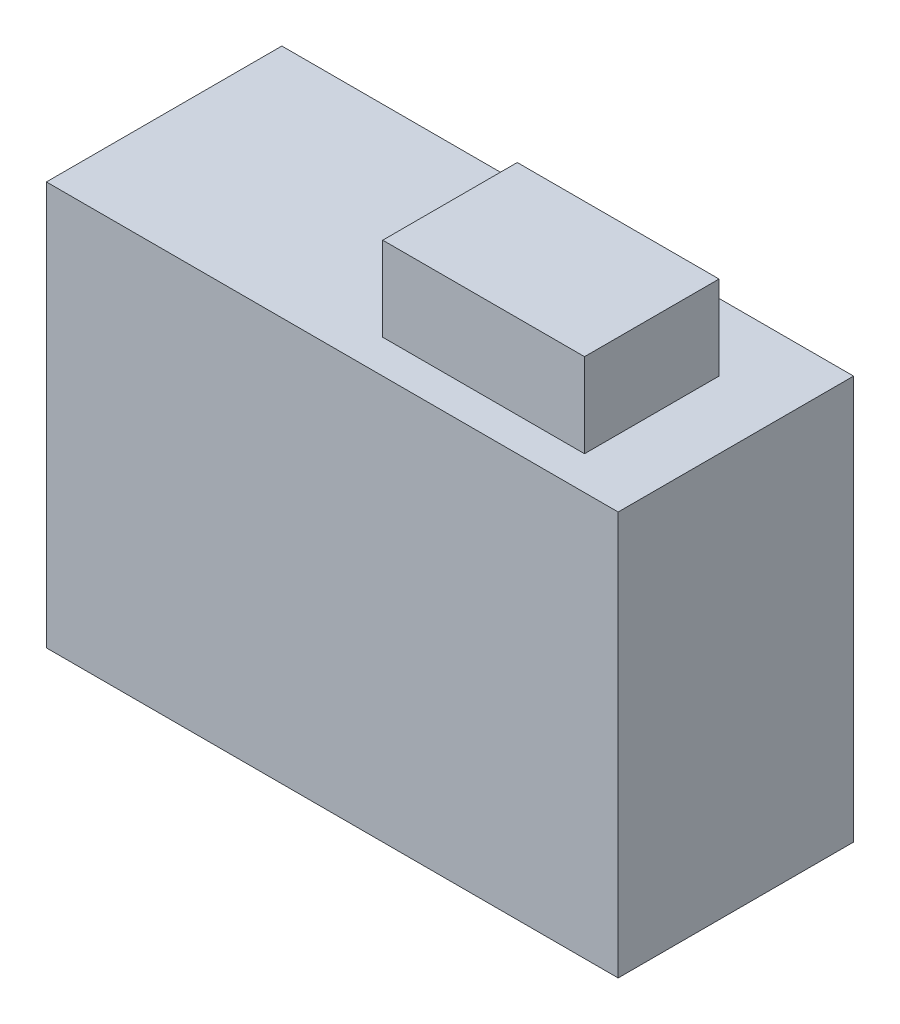
ISO-10303-21;
HEADER;
FILE_DESCRIPTION(('STEP AP214'),'2;1');
FILE_NAME('part.step','',(''),(''),'','','');
FILE_SCHEMA(('AUTOMOTIVE_DESIGN { 1 0 10303 214 1 1 1 1 }'));
ENDSEC;
DATA;
#1=APPLICATION_CONTEXT('core data for automotive mechanical design processes');
#2=APPLICATION_PROTOCOL_DEFINITION('international standard','automotive_design',2000,#1);
#3=PRODUCT_CONTEXT('',#1,'mechanical');
#4=PRODUCT('Part','Part','',(#3));
#5=PRODUCT_RELATED_PRODUCT_CATEGORY('part','',(#4));
#6=PRODUCT_DEFINITION_FORMATION('','',#4);
#7=PRODUCT_DEFINITION_CONTEXT('part definition',#1,'design');
#8=PRODUCT_DEFINITION('design','',#6,#7);
#9=PRODUCT_DEFINITION_SHAPE('','',#8);
#10=(LENGTH_UNIT() NAMED_UNIT(*) SI_UNIT(.MILLI.,.METRE.));
#11=(NAMED_UNIT(*) PLANE_ANGLE_UNIT() SI_UNIT($,.RADIAN.));
#12=(NAMED_UNIT(*) SI_UNIT($,.STERADIAN.) SOLID_ANGLE_UNIT());
#13=UNCERTAINTY_MEASURE_WITH_UNIT(LENGTH_MEASURE(1.E-05),#10,'distance_accuracy_value','');
#14=(GEOMETRIC_REPRESENTATION_CONTEXT(3) GLOBAL_UNCERTAINTY_ASSIGNED_CONTEXT((#13)) GLOBAL_UNIT_ASSIGNED_CONTEXT((#10,
#11,#12)) REPRESENTATION_CONTEXT('',''));
#15=CARTESIAN_POINT('',(0.,0.,0.));
#16=DIRECTION('',(0.,0.,1.));
#17=DIRECTION('',(1.,0.,0.));
#18=AXIS2_PLACEMENT_3D('',#15,#16,#17);
#19=CARTESIAN_POINT('',(-49.7021856630349,31.9514050690939,70.));
#20=DIRECTION('',(0.,-1.,0.));
#21=DIRECTION('',(0.,0.,-1.));
#22=AXIS2_PLACEMENT_3D('',#19,#20,#21);
#23=PLANE('',#22);
#24=DIRECTION('',(-1.,0.,0.));
#25=VECTOR('',#24,1.);
#26=CARTESIAN_POINT('',(-49.7021856630349,31.9514050690939,0.));
#27=LINE('',#26,#25);
#28=CARTESIAN_POINT('',(120.297814336965,31.9514050690939,0.));
#29=VERTEX_POINT('',#28);
#30=CARTESIAN_POINT('',(-49.7021856630349,31.9514050690939,0.));
#31=VERTEX_POINT('',#30);
#32=EDGE_CURVE('E131',#29,#31,#27,.T.);
#33=ORIENTED_EDGE('',*,*,#32,.T.);
#34=DIRECTION('',(0.,0.,-1.));
#35=VECTOR('',#34,1.);
#36=CARTESIAN_POINT('',(-49.7021856630349,31.9514050690939,70.));
#37=LINE('',#36,#35);
#38=CARTESIAN_POINT('',(-49.7021856630349,31.9514050690939,70.));
#39=VERTEX_POINT('',#38);
#40=EDGE_CURVE('E136',#39,#31,#37,.T.);
#41=ORIENTED_EDGE('',*,*,#40,.F.);
#42=DIRECTION('',(-1.,0.,0.));
#43=VECTOR('',#42,1.);
#44=CARTESIAN_POINT('',(-49.7021856630349,31.9514050690939,70.));
#45=LINE('',#44,#43);
#46=CARTESIAN_POINT('',(120.297814336965,31.9514050690939,70.));
#47=VERTEX_POINT('',#46);
#48=EDGE_CURVE('E135',#47,#39,#45,.T.);
#49=ORIENTED_EDGE('',*,*,#48,.F.);
#50=DIRECTION('',(0.,0.,-1.));
#51=VECTOR('',#50,1.);
#52=CARTESIAN_POINT('',(120.297814336965,31.9514050690939,70.));
#53=LINE('',#52,#51);
#54=EDGE_CURVE('E144',#47,#29,#53,.T.);
#55=ORIENTED_EDGE('',*,*,#54,.T.);
#56=EDGE_LOOP('',(#33,#41,#49,#55));
#57=FACE_BOUND('',#56,.T.);
#58=DIRECTION('',(0.,0.,1.));
#59=VECTOR('',#58,1.);
#60=CARTESIAN_POINT('',(40.2978143369651,31.9514050690939,20.));
#61=LINE('',#60,#59);
#62=CARTESIAN_POINT('',(40.2978143369651,31.9514050690939,20.));
#63=VERTEX_POINT('',#62);
#64=CARTESIAN_POINT('',(40.2978143369651,31.9514050690939,60.));
#65=VERTEX_POINT('',#64);
#66=EDGE_CURVE('E117',#63,#65,#61,.T.);
#67=ORIENTED_EDGE('',*,*,#66,.F.);
#68=DIRECTION('',(-1.,0.,0.));
#69=VECTOR('',#68,1.);
#70=CARTESIAN_POINT('',(40.2978143369651,31.9514050690939,20.));
#71=LINE('',#70,#69);
#72=CARTESIAN_POINT('',(100.297814336965,31.9514050690939,20.));
#73=VERTEX_POINT('',#72);
#74=EDGE_CURVE('E114',#73,#63,#71,.T.);
#75=ORIENTED_EDGE('',*,*,#74,.F.);
#76=DIRECTION('',(0.,0.,-1.));
#77=VECTOR('',#76,1.);
#78=CARTESIAN_POINT('',(100.297814336965,31.9514050690939,20.));
#79=LINE('',#78,#77);
#80=CARTESIAN_POINT('',(100.297814336965,31.9514050690939,60.));
#81=VERTEX_POINT('',#80);
#82=EDGE_CURVE('E52',#81,#73,#79,.T.);
#83=ORIENTED_EDGE('',*,*,#82,.F.);
#84=DIRECTION('',(1.,0.,0.));
#85=VECTOR('',#84,1.);
#86=CARTESIAN_POINT('',(40.2978143369651,31.9514050690939,60.));
#87=LINE('',#86,#85);
#88=EDGE_CURVE('E47',#65,#81,#87,.T.);
#89=ORIENTED_EDGE('',*,*,#88,.F.);
#90=EDGE_LOOP('',(#67,#75,#83,#89));
#91=FACE_BOUND('',#90,.T.);
#92=ADVANCED_FACE('F32',(#57,#91),#23,.F.);
#93=CARTESIAN_POINT('',(-49.7021856630349,31.9514050690939,70.));
#94=DIRECTION('',(1.,0.,0.));
#95=DIRECTION('',(0.,1.,0.));
#96=AXIS2_PLACEMENT_3D('',#93,#94,#95);
#97=PLANE('',#96);
#98=DIRECTION('',(0.,-1.,0.));
#99=VECTOR('',#98,1.);
#100=CARTESIAN_POINT('',(-49.7021856630349,31.9514050690939,0.));
#101=LINE('',#100,#99);
#102=CARTESIAN_POINT('',(-49.7021856630349,-88.0485949309061,0.));
#103=VERTEX_POINT('',#102);
#104=EDGE_CURVE('E118',#31,#103,#101,.T.);
#105=ORIENTED_EDGE('',*,*,#104,.T.);
#106=DIRECTION('',(0.,0.,-1.));
#107=VECTOR('',#106,1.);
#108=CARTESIAN_POINT('',(-49.7021856630349,-88.0485949309061,70.));
#109=LINE('',#108,#107);
#110=CARTESIAN_POINT('',(-49.7021856630349,-88.0485949309061,70.));
#111=VERTEX_POINT('',#110);
#112=EDGE_CURVE('E11',#111,#103,#109,.T.);
#113=ORIENTED_EDGE('',*,*,#112,.F.);
#114=DIRECTION('',(0.,-1.,0.));
#115=VECTOR('',#114,1.);
#116=CARTESIAN_POINT('',(-49.7021856630349,31.9514050690939,70.));
#117=LINE('',#116,#115);
#118=EDGE_CURVE('E127',#39,#111,#117,.T.);
#119=ORIENTED_EDGE('',*,*,#118,.F.);
#120=ORIENTED_EDGE('',*,*,#40,.T.);
#121=EDGE_LOOP('',(#105,#113,#119,#120));
#122=FACE_BOUND('',#121,.T.);
#123=ADVANCED_FACE('F34',(#122),#97,.F.);
#124=CARTESIAN_POINT('',(-49.7021856630349,-88.0485949309061,70.));
#125=DIRECTION('',(0.,1.,0.));
#126=DIRECTION('',(0.,0.,1.));
#127=AXIS2_PLACEMENT_3D('',#124,#125,#126);
#128=PLANE('',#127);
#129=DIRECTION('',(1.,0.,0.));
#130=VECTOR('',#129,1.);
#131=CARTESIAN_POINT('',(-49.7021856630349,-88.0485949309061,0.));
#132=LINE('',#131,#130);
#133=CARTESIAN_POINT('',(120.297814336965,-88.0485949309061,0.));
#134=VERTEX_POINT('',#133);
#135=EDGE_CURVE('E121',#103,#134,#132,.T.);
#136=ORIENTED_EDGE('',*,*,#135,.T.);
#137=DIRECTION('',(0.,0.,-1.));
#138=VECTOR('',#137,1.);
#139=CARTESIAN_POINT('',(120.297814336965,-88.0485949309061,70.));
#140=LINE('',#139,#138);
#141=CARTESIAN_POINT('',(120.297814336965,-88.0485949309061,70.));
#142=VERTEX_POINT('',#141);
#143=EDGE_CURVE('E40',#142,#134,#140,.T.);
#144=ORIENTED_EDGE('',*,*,#143,.F.);
#145=DIRECTION('',(1.,0.,0.));
#146=VECTOR('',#145,1.);
#147=CARTESIAN_POINT('',(-49.7021856630349,-88.0485949309061,70.));
#148=LINE('',#147,#146);
#149=EDGE_CURVE('E130',#111,#142,#148,.T.);
#150=ORIENTED_EDGE('',*,*,#149,.F.);
#151=ORIENTED_EDGE('',*,*,#112,.T.);
#152=EDGE_LOOP('',(#136,#144,#150,#151));
#153=FACE_BOUND('',#152,.T.);
#154=ADVANCED_FACE('F166',(#153),#128,.F.);
#155=CARTESIAN_POINT('',(120.297814336965,31.9514050690939,70.));
#156=DIRECTION('',(-1.,0.,0.));
#157=DIRECTION('',(0.,-1.,0.));
#158=AXIS2_PLACEMENT_3D('',#155,#156,#157);
#159=PLANE('',#158);
#160=DIRECTION('',(0.,1.,0.));
#161=VECTOR('',#160,1.);
#162=CARTESIAN_POINT('',(120.297814336965,31.9514050690939,0.));
#163=LINE('',#162,#161);
#164=EDGE_CURVE('E139',#134,#29,#163,.T.);
#165=ORIENTED_EDGE('',*,*,#164,.T.);
#166=ORIENTED_EDGE('',*,*,#54,.F.);
#167=DIRECTION('',(0.,1.,0.));
#168=VECTOR('',#167,1.);
#169=CARTESIAN_POINT('',(120.297814336965,31.9514050690939,70.));
#170=LINE('',#169,#168);
#171=EDGE_CURVE('E133',#142,#47,#170,.T.);
#172=ORIENTED_EDGE('',*,*,#171,.F.);
#173=ORIENTED_EDGE('',*,*,#143,.T.);
#174=EDGE_LOOP('',(#165,#166,#172,#173));
#175=FACE_BOUND('',#174,.T.);
#176=ADVANCED_FACE('F151',(#175),#159,.F.);
#177=CARTESIAN_POINT('',(-49.7021856630349,-88.0485949309061,70.));
#178=DIRECTION('',(0.,0.,1.));
#179=DIRECTION('',(1.,0.,0.));
#180=AXIS2_PLACEMENT_3D('',#177,#178,#179);
#181=PLANE('',#180);
#182=ORIENTED_EDGE('',*,*,#118,.T.);
#183=ORIENTED_EDGE('',*,*,#149,.T.);
#184=ORIENTED_EDGE('',*,*,#171,.T.);
#185=ORIENTED_EDGE('',*,*,#48,.T.);
#186=EDGE_LOOP('',(#182,#183,#184,#185));
#187=FACE_BOUND('',#186,.T.);
#188=ADVANCED_FACE('F165',(#187),#181,.T.);
#189=CARTESIAN_POINT('',(-49.7021856630349,-88.0485949309061,0.));
#190=DIRECTION('',(0.,0.,1.));
#191=DIRECTION('',(1.,0.,0.));
#192=AXIS2_PLACEMENT_3D('',#189,#190,#191);
#193=PLANE('',#192);
#194=ORIENTED_EDGE('',*,*,#104,.F.);
#195=ORIENTED_EDGE('',*,*,#32,.F.);
#196=ORIENTED_EDGE('',*,*,#164,.F.);
#197=ORIENTED_EDGE('',*,*,#135,.F.);
#198=EDGE_LOOP('',(#194,#195,#196,#197));
#199=FACE_BOUND('',#198,.T.);
#200=ADVANCED_FACE('F157',(#199),#193,.F.);
#201=CARTESIAN_POINT('',(40.2978143369651,56.9514050690939,20.));
#202=DIRECTION('',(1.,0.,0.));
#203=DIRECTION('',(0.,0.,-1.));
#204=AXIS2_PLACEMENT_3D('',#201,#202,#203);
#205=PLANE('',#204);
#206=ORIENTED_EDGE('',*,*,#66,.T.);
#207=DIRECTION('',(0.,-1.,0.));
#208=VECTOR('',#207,1.);
#209=CARTESIAN_POINT('',(40.2978143369651,56.9514050690939,60.));
#210=LINE('',#209,#208);
#211=CARTESIAN_POINT('',(40.2978143369651,56.9514050690939,60.));
#212=VERTEX_POINT('',#211);
#213=EDGE_CURVE('E98',#212,#65,#210,.T.);
#214=ORIENTED_EDGE('',*,*,#213,.F.);
#215=DIRECTION('',(0.,0.,1.));
#216=VECTOR('',#215,1.);
#217=CARTESIAN_POINT('',(40.2978143369651,56.9514050690939,20.));
#218=LINE('',#217,#216);
#219=CARTESIAN_POINT('',(40.2978143369651,56.9514050690939,20.));
#220=VERTEX_POINT('',#219);
#221=EDGE_CURVE('E105',#220,#212,#218,.T.);
#222=ORIENTED_EDGE('',*,*,#221,.F.);
#223=DIRECTION('',(0.,-1.,0.));
#224=VECTOR('',#223,1.);
#225=CARTESIAN_POINT('',(40.2978143369651,56.9514050690939,20.));
#226=LINE('',#225,#224);
#227=EDGE_CURVE('E259',#220,#63,#226,.T.);
#228=ORIENTED_EDGE('',*,*,#227,.T.);
#229=EDGE_LOOP('',(#206,#214,#222,#228));
#230=FACE_BOUND('',#229,.T.);
#231=ADVANCED_FACE('F116',(#230),#205,.F.);
#232=CARTESIAN_POINT('',(40.2978143369651,56.9514050690939,60.));
#233=DIRECTION('',(0.,0.,-1.));
#234=DIRECTION('',(-1.,0.,0.));
#235=AXIS2_PLACEMENT_3D('',#232,#233,#234);
#236=PLANE('',#235);
#237=ORIENTED_EDGE('',*,*,#88,.T.);
#238=DIRECTION('',(0.,-1.,0.));
#239=VECTOR('',#238,1.);
#240=CARTESIAN_POINT('',(100.297814336965,56.9514050690939,60.));
#241=LINE('',#240,#239);
#242=CARTESIAN_POINT('',(100.297814336965,56.9514050690939,60.));
#243=VERTEX_POINT('',#242);
#244=EDGE_CURVE('E101',#243,#81,#241,.T.);
#245=ORIENTED_EDGE('',*,*,#244,.F.);
#246=DIRECTION('',(1.,0.,0.));
#247=VECTOR('',#246,1.);
#248=CARTESIAN_POINT('',(40.2978143369651,56.9514050690939,60.));
#249=LINE('',#248,#247);
#250=EDGE_CURVE('E94',#212,#243,#249,.T.);
#251=ORIENTED_EDGE('',*,*,#250,.F.);
#252=ORIENTED_EDGE('',*,*,#213,.T.);
#253=EDGE_LOOP('',(#237,#245,#251,#252));
#254=FACE_BOUND('',#253,.T.);
#255=ADVANCED_FACE('F96',(#254),#236,.F.);
#256=CARTESIAN_POINT('',(100.297814336965,56.9514050690939,20.));
#257=DIRECTION('',(-1.,0.,0.));
#258=DIRECTION('',(0.,0.,1.));
#259=AXIS2_PLACEMENT_3D('',#256,#257,#258);
#260=PLANE('',#259);
#261=ORIENTED_EDGE('',*,*,#82,.T.);
#262=DIRECTION('',(0.,-1.,0.));
#263=VECTOR('',#262,1.);
#264=CARTESIAN_POINT('',(100.297814336965,56.9514050690939,20.));
#265=LINE('',#264,#263);
#266=CARTESIAN_POINT('',(100.297814336965,56.9514050690939,20.));
#267=VERTEX_POINT('',#266);
#268=EDGE_CURVE('E123',#267,#73,#265,.T.);
#269=ORIENTED_EDGE('',*,*,#268,.F.);
#270=DIRECTION('',(0.,0.,-1.));
#271=VECTOR('',#270,1.);
#272=CARTESIAN_POINT('',(100.297814336965,56.9514050690939,20.));
#273=LINE('',#272,#271);
#274=EDGE_CURVE('E104',#243,#267,#273,.T.);
#275=ORIENTED_EDGE('',*,*,#274,.F.);
#276=ORIENTED_EDGE('',*,*,#244,.T.);
#277=EDGE_LOOP('',(#261,#269,#275,#276));
#278=FACE_BOUND('',#277,.T.);
#279=ADVANCED_FACE('F186',(#278),#260,.F.);
#280=CARTESIAN_POINT('',(40.2978143369651,56.9514050690939,20.));
#281=DIRECTION('',(0.,0.,1.));
#282=DIRECTION('',(1.,0.,0.));
#283=AXIS2_PLACEMENT_3D('',#280,#281,#282);
#284=PLANE('',#283);
#285=ORIENTED_EDGE('',*,*,#74,.T.);
#286=ORIENTED_EDGE('',*,*,#227,.F.);
#287=DIRECTION('',(-1.,0.,0.));
#288=VECTOR('',#287,1.);
#289=CARTESIAN_POINT('',(40.2978143369651,56.9514050690939,20.));
#290=LINE('',#289,#288);
#291=EDGE_CURVE('E110',#267,#220,#290,.T.);
#292=ORIENTED_EDGE('',*,*,#291,.F.);
#293=ORIENTED_EDGE('',*,*,#268,.T.);
#294=EDGE_LOOP('',(#285,#286,#292,#293));
#295=FACE_BOUND('',#294,.T.);
#296=ADVANCED_FACE('F189',(#295),#284,.F.);
#297=CARTESIAN_POINT('',(40.2978143369651,56.9514050690939,60.));
#298=DIRECTION('',(0.,1.,0.));
#299=DIRECTION('',(0.,0.,1.));
#300=AXIS2_PLACEMENT_3D('',#297,#298,#299);
#301=PLANE('',#300);
#302=ORIENTED_EDGE('',*,*,#221,.T.);
#303=ORIENTED_EDGE('',*,*,#250,.T.);
#304=ORIENTED_EDGE('',*,*,#274,.T.);
#305=ORIENTED_EDGE('',*,*,#291,.T.);
#306=EDGE_LOOP('',(#302,#303,#304,#305));
#307=FACE_BOUND('',#306,.T.);
#308=ADVANCED_FACE('F108',(#307),#301,.T.);
#309=CLOSED_SHELL('',(#92,#123,#154,#176,#188,#200,#231,#255,#279,#296,#308));
#310=MANIFOLD_SOLID_BREP('B2',#309);
#311=ADVANCED_BREP_SHAPE_REPRESENTATION('',(#18,#310),#14);
#312=SHAPE_DEFINITION_REPRESENTATION(#9,#311);
ENDSEC;
END-ISO-10303-21;
